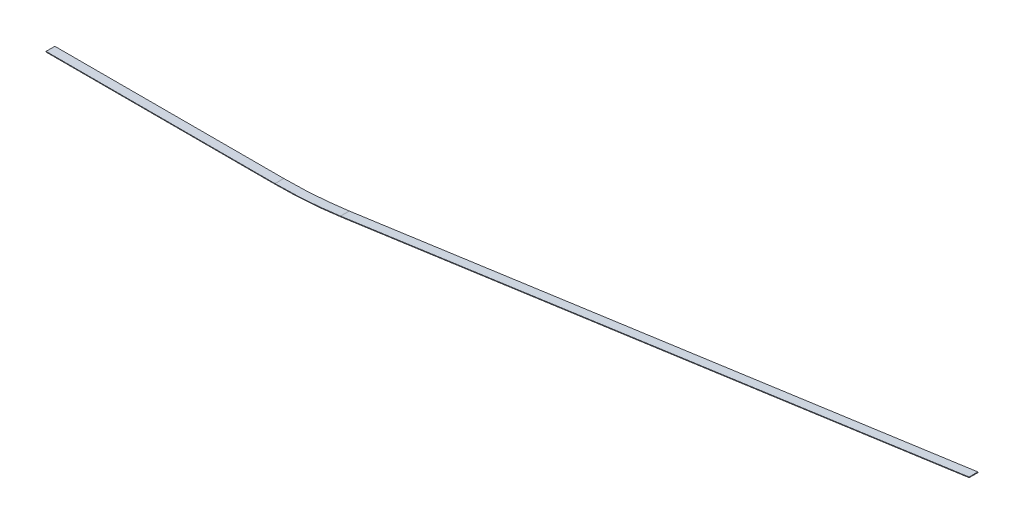
ISO-10303-21;
HEADER;
FILE_DESCRIPTION(('STEP AP214'),'2;1');
FILE_NAME('part.step','',(''),(''),'','','');
FILE_SCHEMA(('AUTOMOTIVE_DESIGN { 1 0 10303 214 1 1 1 1 }'));
ENDSEC;
DATA;
#1=APPLICATION_CONTEXT('core data for automotive mechanical design processes');
#2=APPLICATION_PROTOCOL_DEFINITION('international standard','automotive_design',2000,#1);
#3=PRODUCT_CONTEXT('',#1,'mechanical');
#4=PRODUCT('Part','Part','',(#3));
#5=PRODUCT_RELATED_PRODUCT_CATEGORY('part','',(#4));
#6=PRODUCT_DEFINITION_FORMATION('','',#4);
#7=PRODUCT_DEFINITION_CONTEXT('part definition',#1,'design');
#8=PRODUCT_DEFINITION('design','',#6,#7);
#9=PRODUCT_DEFINITION_SHAPE('','',#8);
#10=(LENGTH_UNIT() NAMED_UNIT(*) SI_UNIT(.MILLI.,.METRE.));
#11=(NAMED_UNIT(*) PLANE_ANGLE_UNIT() SI_UNIT($,.RADIAN.));
#12=(NAMED_UNIT(*) SI_UNIT($,.STERADIAN.) SOLID_ANGLE_UNIT());
#13=UNCERTAINTY_MEASURE_WITH_UNIT(LENGTH_MEASURE(1.E-05),#10,'distance_accuracy_value','');
#14=(GEOMETRIC_REPRESENTATION_CONTEXT(3) GLOBAL_UNCERTAINTY_ASSIGNED_CONTEXT((#13)) GLOBAL_UNIT_ASSIGNED_CONTEXT((#10,
#11,#12)) REPRESENTATION_CONTEXT('',''));
#15=CARTESIAN_POINT('',(0.,0.,0.));
#16=DIRECTION('',(0.,0.,1.));
#17=DIRECTION('',(1.,0.,0.));
#18=AXIS2_PLACEMENT_3D('',#15,#16,#17);
#19=CARTESIAN_POINT('',(5501.69221697348,2965.86739895074,9.525));
#20=DIRECTION('',(0.,1.,0.));
#21=DIRECTION('',(-1.,0.,0.));
#22=AXIS2_PLACEMENT_3D('',#19,#20,#21);
#23=PLANE('',#22);
#24=DIRECTION('',(1.,0.,0.));
#25=VECTOR('',#24,1.);
#26=CARTESIAN_POINT('',(5501.69221697348,2965.86739895074,0.));
#27=LINE('',#26,#25);
#28=CARTESIAN_POINT('',(5501.69221697348,2965.86739895074,0.));
#29=VERTEX_POINT('',#28);
#30=CARTESIAN_POINT('',(5748.74439650617,2965.86739895074,0.));
#31=VERTEX_POINT('',#30);
#32=EDGE_CURVE('E131',#29,#31,#27,.T.);
#33=ORIENTED_EDGE('',*,*,#32,.T.);
#34=DIRECTION('',(0.,0.,-1.));
#35=VECTOR('',#34,1.);
#36=CARTESIAN_POINT('',(5748.74439650617,2965.86739895074,9.525));
#37=LINE('',#36,#35);
#38=CARTESIAN_POINT('',(5748.74439650617,2965.86739895074,9.525));
#39=VERTEX_POINT('',#38);
#40=EDGE_CURVE('E11',#39,#31,#37,.T.);
#41=ORIENTED_EDGE('',*,*,#40,.F.);
#42=DIRECTION('',(1.,0.,0.));
#43=VECTOR('',#42,1.);
#44=CARTESIAN_POINT('',(5501.69221697348,2965.86739895074,9.525));
#45=LINE('',#44,#43);
#46=CARTESIAN_POINT('',(5501.69221697348,2965.86739895074,9.525));
#47=VERTEX_POINT('',#46);
#48=EDGE_CURVE('E145',#47,#39,#45,.T.);
#49=ORIENTED_EDGE('',*,*,#48,.F.);
#50=DIRECTION('',(0.,0.,-1.));
#51=VECTOR('',#50,1.);
#52=CARTESIAN_POINT('',(5501.69221697348,2965.86739895074,9.525));
#53=LINE('',#52,#51);
#54=EDGE_CURVE('E127',#47,#29,#53,.T.);
#55=ORIENTED_EDGE('',*,*,#54,.T.);
#56=EDGE_LOOP('',(#33,#41,#49,#55));
#57=FACE_BOUND('',#56,.T.);
#58=ADVANCED_FACE('F35',(#57),#23,.F.);
#59=CARTESIAN_POINT('',(5748.74439650617,3474.50239895074,9.525));
#60=DIRECTION('',(0.,0.,-1.));
#61=DIRECTION('',(-1.,0.,0.));
#62=AXIS2_PLACEMENT_3D('',#59,#60,#61);
#63=CYLINDRICAL_SURFACE('',#62,508.635000000001);
#64=CARTESIAN_POINT('',(5748.74439650617,3474.50239895074,0.));
#65=DIRECTION('',(0.,0.,1.));
#66=DIRECTION('',(1.,0.,0.));
#67=AXIS2_PLACEMENT_3D('',#64,#65,#66);
#68=CIRCLE('',#67,508.635000000001);
#69=CARTESIAN_POINT('',(5819.532706713,2970.81739980637,0.));
#70=VERTEX_POINT('',#69);
#71=EDGE_CURVE('E134',#31,#70,#68,.T.);
#72=ORIENTED_EDGE('',*,*,#71,.T.);
#73=DIRECTION('',(0.,0.,-1.));
#74=VECTOR('',#73,1.);
#75=CARTESIAN_POINT('',(5819.532706713,2970.81739980637,9.525));
#76=LINE('',#75,#74);
#77=CARTESIAN_POINT('',(5819.532706713,2970.81739980637,9.525));
#78=VERTEX_POINT('',#77);
#79=EDGE_CURVE('E43',#78,#70,#76,.T.);
#80=ORIENTED_EDGE('',*,*,#79,.F.);
#81=CARTESIAN_POINT('',(5748.74439650617,3474.50239895074,9.525));
#82=DIRECTION('',(0.,0.,1.));
#83=DIRECTION('',(1.,0.,0.));
#84=AXIS2_PLACEMENT_3D('',#81,#82,#83);
#85=CIRCLE('',#84,508.635000000001);
#86=EDGE_CURVE('E94',#39,#78,#85,.T.);
#87=ORIENTED_EDGE('',*,*,#86,.F.);
#88=ORIENTED_EDGE('',*,*,#40,.T.);
#89=EDGE_LOOP('',(#72,#80,#87,#88));
#90=FACE_BOUND('',#89,.T.);
#91=ADVANCED_FACE('F180',(#90),#63,.T.);
#92=CARTESIAN_POINT('',(5819.532706713,2970.81739980637,9.525));
#93=DIRECTION('',(-0.139173100960063,0.990268068741571,0.));
#94=DIRECTION('',(-0.990268068741571,-0.139173100960063,0.));
#95=AXIS2_PLACEMENT_3D('',#92,#93,#94);
#96=PLANE('',#95);
#97=DIRECTION('',(0.990268068741571,0.139173100960063,0.));
#98=VECTOR('',#97,1.);
#99=CARTESIAN_POINT('',(5819.532706713,2970.81739980637,0.));
#100=LINE('',#99,#98);
#101=CARTESIAN_POINT('',(6497.73059189259,3066.13189668291,0.));
#102=VERTEX_POINT('',#101);
#103=EDGE_CURVE('E136',#70,#102,#100,.T.);
#104=ORIENTED_EDGE('',*,*,#103,.T.);
#105=DIRECTION('',(0.,0.,-1.));
#106=VECTOR('',#105,1.);
#107=CARTESIAN_POINT('',(6497.73059189259,3066.13189668291,9.525));
#108=LINE('',#107,#106);
#109=CARTESIAN_POINT('',(6497.73059189259,3066.13189668291,9.525));
#110=VERTEX_POINT('',#109);
#111=EDGE_CURVE('E152',#110,#102,#108,.T.);
#112=ORIENTED_EDGE('',*,*,#111,.F.);
#113=DIRECTION('',(0.990268068741571,0.139173100960063,0.));
#114=VECTOR('',#113,1.);
#115=CARTESIAN_POINT('',(5819.532706713,2970.81739980637,9.525));
#116=LINE('',#115,#114);
#117=EDGE_CURVE('E160',#78,#110,#116,.T.);
#118=ORIENTED_EDGE('',*,*,#117,.F.);
#119=ORIENTED_EDGE('',*,*,#79,.T.);
#120=EDGE_LOOP('',(#104,#112,#118,#119));
#121=FACE_BOUND('',#120,.T.);
#122=ADVANCED_FACE('F158',(#121),#96,.F.);
#123=CARTESIAN_POINT('',(6497.73059189259,3066.13189668291,9.525));
#124=DIRECTION('',(-0.990268068741545,-0.139173100960247,0.));
#125=DIRECTION('',(0.139173100960247,-0.990268068741545,0.));
#126=AXIS2_PLACEMENT_3D('',#123,#124,#125);
#127=PLANE('',#126);
#128=DIRECTION('',(-0.139173100960247,0.990268068741545,0.));
#129=VECTOR('',#128,1.);
#130=CARTESIAN_POINT('',(6497.73059189259,3066.13189668291,0.));
#131=LINE('',#130,#129);
#132=CARTESIAN_POINT('',(6497.64221697348,3066.76071690656,0.));
#133=VERTEX_POINT('',#132);
#134=EDGE_CURVE('E138',#102,#133,#131,.T.);
#135=ORIENTED_EDGE('',*,*,#134,.T.);
#136=DIRECTION('',(0.,0.,-1.));
#137=VECTOR('',#136,1.);
#138=CARTESIAN_POINT('',(6497.64221697348,3066.76071690656,9.525));
#139=LINE('',#138,#137);
#140=CARTESIAN_POINT('',(6497.64221697348,3066.76071690656,9.525));
#141=VERTEX_POINT('',#140);
#142=EDGE_CURVE('E149',#141,#133,#139,.T.);
#143=ORIENTED_EDGE('',*,*,#142,.F.);
#144=DIRECTION('',(-0.139173100960247,0.990268068741545,0.));
#145=VECTOR('',#144,1.);
#146=CARTESIAN_POINT('',(6497.73059189259,3066.13189668291,9.525));
#147=LINE('',#146,#145);
#148=EDGE_CURVE('E172',#110,#141,#147,.T.);
#149=ORIENTED_EDGE('',*,*,#148,.F.);
#150=ORIENTED_EDGE('',*,*,#111,.T.);
#151=EDGE_LOOP('',(#135,#143,#149,#150));
#152=FACE_BOUND('',#151,.T.);
#153=ADVANCED_FACE('F168',(#152),#127,.F.);
#154=CARTESIAN_POINT('',(5819.44433179389,2971.44622003003,9.525));
#155=DIRECTION('',(0.139173100960063,-0.990268068741571,0.));
#156=DIRECTION('',(0.990268068741571,0.139173100960063,0.));
#157=AXIS2_PLACEMENT_3D('',#154,#155,#156);
#158=PLANE('',#157);
#159=DIRECTION('',(-0.990268068741571,-0.139173100960063,0.));
#160=VECTOR('',#159,1.);
#161=CARTESIAN_POINT('',(5819.44433179389,2971.44622003003,0.));
#162=LINE('',#161,#160);
#163=CARTESIAN_POINT('',(5819.44433179389,2971.44622003003,0.));
#164=VERTEX_POINT('',#163);
#165=EDGE_CURVE('E140',#133,#164,#162,.T.);
#166=ORIENTED_EDGE('',*,*,#165,.T.);
#167=DIRECTION('',(0.,0.,-1.));
#168=VECTOR('',#167,1.);
#169=CARTESIAN_POINT('',(5819.44433179389,2971.44622003003,9.525));
#170=LINE('',#169,#168);
#171=CARTESIAN_POINT('',(5819.44433179389,2971.44622003003,9.525));
#172=VERTEX_POINT('',#171);
#173=EDGE_CURVE('E122',#172,#164,#170,.T.);
#174=ORIENTED_EDGE('',*,*,#173,.F.);
#175=DIRECTION('',(-0.990268068741571,-0.139173100960063,0.));
#176=VECTOR('',#175,1.);
#177=CARTESIAN_POINT('',(5819.44433179389,2971.44622003003,9.525));
#178=LINE('',#177,#176);
#179=EDGE_CURVE('E113',#141,#172,#178,.T.);
#180=ORIENTED_EDGE('',*,*,#179,.F.);
#181=ORIENTED_EDGE('',*,*,#142,.T.);
#182=EDGE_LOOP('',(#166,#174,#180,#181));
#183=FACE_BOUND('',#182,.T.);
#184=ADVANCED_FACE('F171',(#183),#158,.F.);
#185=CARTESIAN_POINT('',(5748.74439650617,3474.50239895074,9.525));
#186=DIRECTION('',(0.,0.,-1.));
#187=DIRECTION('',(-1.,0.,0.));
#188=AXIS2_PLACEMENT_3D('',#185,#186,#187);
#189=CYLINDRICAL_SURFACE('',#188,508.);
#190=CARTESIAN_POINT('',(5748.74439650617,3474.50239895074,0.));
#191=DIRECTION('',(0.,0.,-1.));
#192=DIRECTION('',(1.,0.,0.));
#193=AXIS2_PLACEMENT_3D('',#190,#191,#192);
#194=CIRCLE('',#193,508.);
#195=CARTESIAN_POINT('',(5748.74439650617,2966.50239895074,0.));
#196=VERTEX_POINT('',#195);
#197=EDGE_CURVE('E121',#164,#196,#194,.T.);
#198=ORIENTED_EDGE('',*,*,#197,.T.);
#199=DIRECTION('',(0.,0.,-1.));
#200=VECTOR('',#199,1.);
#201=CARTESIAN_POINT('',(5748.74439650617,2966.50239895074,9.525));
#202=LINE('',#201,#200);
#203=CARTESIAN_POINT('',(5748.74439650617,2966.50239895074,9.525));
#204=VERTEX_POINT('',#203);
#205=EDGE_CURVE('E118',#204,#196,#202,.T.);
#206=ORIENTED_EDGE('',*,*,#205,.F.);
#207=CARTESIAN_POINT('',(5748.74439650617,3474.50239895074,9.525));
#208=DIRECTION('',(0.,0.,-1.));
#209=DIRECTION('',(1.,0.,0.));
#210=AXIS2_PLACEMENT_3D('',#207,#208,#209);
#211=CIRCLE('',#210,508.);
#212=EDGE_CURVE('E107',#172,#204,#211,.T.);
#213=ORIENTED_EDGE('',*,*,#212,.F.);
#214=ORIENTED_EDGE('',*,*,#173,.T.);
#215=EDGE_LOOP('',(#198,#206,#213,#214));
#216=FACE_BOUND('',#215,.T.);
#217=ADVANCED_FACE('F119',(#216),#189,.F.);
#218=CARTESIAN_POINT('',(5501.69221697348,2966.50239895074,9.525));
#219=DIRECTION('',(0.,-1.,0.));
#220=DIRECTION('',(1.,0.,0.));
#221=AXIS2_PLACEMENT_3D('',#218,#219,#220);
#222=PLANE('',#221);
#223=DIRECTION('',(-1.,0.,0.));
#224=VECTOR('',#223,1.);
#225=CARTESIAN_POINT('',(5501.69221697348,2966.50239895074,0.));
#226=LINE('',#225,#224);
#227=CARTESIAN_POINT('',(5501.69221697348,2966.50239895074,0.));
#228=VERTEX_POINT('',#227);
#229=EDGE_CURVE('E80',#196,#228,#226,.T.);
#230=ORIENTED_EDGE('',*,*,#229,.T.);
#231=DIRECTION('',(0.,0.,-1.));
#232=VECTOR('',#231,1.);
#233=CARTESIAN_POINT('',(5501.69221697348,2966.50239895074,9.525));
#234=LINE('',#233,#232);
#235=CARTESIAN_POINT('',(5501.69221697348,2966.50239895074,9.525));
#236=VERTEX_POINT('',#235);
#237=EDGE_CURVE('E123',#236,#228,#234,.T.);
#238=ORIENTED_EDGE('',*,*,#237,.F.);
#239=DIRECTION('',(-1.,0.,0.));
#240=VECTOR('',#239,1.);
#241=CARTESIAN_POINT('',(5501.69221697348,2966.50239895074,9.525));
#242=LINE('',#241,#240);
#243=EDGE_CURVE('E111',#204,#236,#242,.T.);
#244=ORIENTED_EDGE('',*,*,#243,.F.);
#245=ORIENTED_EDGE('',*,*,#205,.T.);
#246=EDGE_LOOP('',(#230,#238,#244,#245));
#247=FACE_BOUND('',#246,.T.);
#248=ADVANCED_FACE('F125',(#247),#222,.F.);
#249=CARTESIAN_POINT('',(5501.69221697348,2965.86739895074,9.525));
#250=DIRECTION('',(1.,0.,0.));
#251=DIRECTION('',(0.,0.,-1.));
#252=AXIS2_PLACEMENT_3D('',#249,#250,#251);
#253=PLANE('',#252);
#254=DIRECTION('',(0.,-1.,0.));
#255=VECTOR('',#254,1.);
#256=CARTESIAN_POINT('',(5501.69221697348,2965.86739895074,0.));
#257=LINE('',#256,#255);
#258=EDGE_CURVE('E86',#228,#29,#257,.T.);
#259=ORIENTED_EDGE('',*,*,#258,.T.);
#260=ORIENTED_EDGE('',*,*,#54,.F.);
#261=DIRECTION('',(0.,-1.,0.));
#262=VECTOR('',#261,1.);
#263=CARTESIAN_POINT('',(5501.69221697348,2965.86739895074,9.525));
#264=LINE('',#263,#262);
#265=EDGE_CURVE('E51',#236,#47,#264,.T.);
#266=ORIENTED_EDGE('',*,*,#265,.F.);
#267=ORIENTED_EDGE('',*,*,#237,.T.);
#268=EDGE_LOOP('',(#259,#260,#266,#267));
#269=FACE_BOUND('',#268,.T.);
#270=ADVANCED_FACE('F196',(#269),#253,.F.);
#271=CARTESIAN_POINT('',(5748.74439650617,3474.50239895074,9.525));
#272=DIRECTION('',(0.,0.,1.));
#273=DIRECTION('',(1.,0.,0.));
#274=AXIS2_PLACEMENT_3D('',#271,#272,#273);
#275=PLANE('',#274);
#276=ORIENTED_EDGE('',*,*,#48,.T.);
#277=ORIENTED_EDGE('',*,*,#86,.T.);
#278=ORIENTED_EDGE('',*,*,#117,.T.);
#279=ORIENTED_EDGE('',*,*,#148,.T.);
#280=ORIENTED_EDGE('',*,*,#179,.T.);
#281=ORIENTED_EDGE('',*,*,#212,.T.);
#282=ORIENTED_EDGE('',*,*,#243,.T.);
#283=ORIENTED_EDGE('',*,*,#265,.T.);
#284=EDGE_LOOP('',(#276,#277,#278,#279,#280,#281,#282,#283));
#285=FACE_BOUND('',#284,.T.);
#286=ADVANCED_FACE('F109',(#285),#275,.T.);
#287=CARTESIAN_POINT('',(5748.74439650617,3474.50239895074,0.));
#288=DIRECTION('',(0.,0.,1.));
#289=DIRECTION('',(1.,0.,0.));
#290=AXIS2_PLACEMENT_3D('',#287,#288,#289);
#291=PLANE('',#290);
#292=ORIENTED_EDGE('',*,*,#32,.F.);
#293=ORIENTED_EDGE('',*,*,#258,.F.);
#294=ORIENTED_EDGE('',*,*,#229,.F.);
#295=ORIENTED_EDGE('',*,*,#197,.F.);
#296=ORIENTED_EDGE('',*,*,#165,.F.);
#297=ORIENTED_EDGE('',*,*,#134,.F.);
#298=ORIENTED_EDGE('',*,*,#103,.F.);
#299=ORIENTED_EDGE('',*,*,#71,.F.);
#300=EDGE_LOOP('',(#292,#293,#294,#295,#296,#297,#298,#299));
#301=FACE_BOUND('',#300,.T.);
#302=ADVANCED_FACE('F164',(#301),#291,.F.);
#303=CLOSED_SHELL('',(#58,#91,#122,#153,#184,#217,#248,#270,#286,#302));
#304=MANIFOLD_SOLID_BREP('B2',#303);
#305=ADVANCED_BREP_SHAPE_REPRESENTATION('',(#18,#304),#14);
#306=SHAPE_DEFINITION_REPRESENTATION(#9,#305);
ENDSEC;
END-ISO-10303-21;
